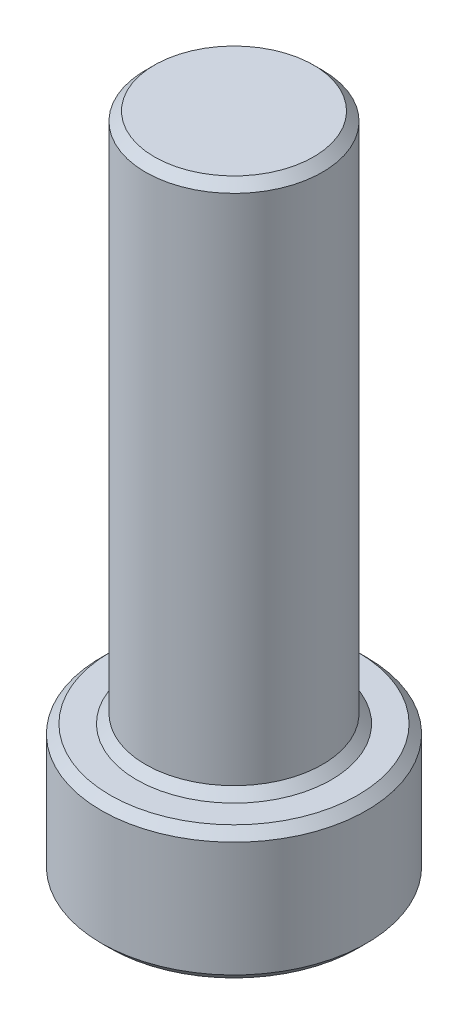
ISO-10303-21;
HEADER;
FILE_DESCRIPTION(('STEP AP214'),'2;1');
FILE_NAME('part.step','',(''),(''),'','','');
FILE_SCHEMA(('AUTOMOTIVE_DESIGN { 1 0 10303 214 1 1 1 1 }'));
ENDSEC;
DATA;
#1=APPLICATION_CONTEXT('core data for automotive mechanical design processes');
#2=APPLICATION_PROTOCOL_DEFINITION('international standard','automotive_design',2000,#1);
#3=PRODUCT_CONTEXT('',#1,'mechanical');
#4=PRODUCT('Part','Part','',(#3));
#5=PRODUCT_RELATED_PRODUCT_CATEGORY('part','',(#4));
#6=PRODUCT_DEFINITION_FORMATION('','',#4);
#7=PRODUCT_DEFINITION_CONTEXT('part definition',#1,'design');
#8=PRODUCT_DEFINITION('design','',#6,#7);
#9=PRODUCT_DEFINITION_SHAPE('','',#8);
#10=(LENGTH_UNIT() NAMED_UNIT(*) SI_UNIT(.MILLI.,.METRE.));
#11=(NAMED_UNIT(*) PLANE_ANGLE_UNIT() SI_UNIT($,.RADIAN.));
#12=(NAMED_UNIT(*) SI_UNIT($,.STERADIAN.) SOLID_ANGLE_UNIT());
#13=UNCERTAINTY_MEASURE_WITH_UNIT(LENGTH_MEASURE(1.E-05),#10,'distance_accuracy_value','');
#14=(GEOMETRIC_REPRESENTATION_CONTEXT(3) GLOBAL_UNCERTAINTY_ASSIGNED_CONTEXT((#13)) GLOBAL_UNIT_ASSIGNED_CONTEXT((#10,
#11,#12)) REPRESENTATION_CONTEXT('',''));
#15=CARTESIAN_POINT('',(0.,0.,0.));
#16=DIRECTION('',(0.,0.,1.));
#17=DIRECTION('',(1.,0.,0.));
#18=AXIS2_PLACEMENT_3D('',#15,#16,#17);
#19=CARTESIAN_POINT('',(0.,3.,0.));
#20=DIRECTION('',(0.,-1.,0.));
#21=DIRECTION('',(0.,0.,-1.));
#22=AXIS2_PLACEMENT_3D('',#19,#20,#21);
#23=CYLINDRICAL_SURFACE('',#22,3.);
#24=CARTESIAN_POINT('',(0.,2.8,0.));
#25=DIRECTION('',(0.,1.,0.));
#26=DIRECTION('',(0.,0.,1.));
#27=AXIS2_PLACEMENT_3D('',#24,#25,#26);
#28=CIRCLE('',#27,3.);
#29=CARTESIAN_POINT('',(0.,2.8,-3.));
#30=VERTEX_POINT('',#29);
#31=EDGE_CURVE('E50',#30,#30,#28,.F.);
#32=ORIENTED_EDGE('',*,*,#31,.T.);
#33=EDGE_LOOP('',(#32));
#34=FACE_BOUND('',#33,.T.);
#35=CARTESIAN_POINT('',(0.,0.200000000000001,0.));
#36=DIRECTION('',(0.,1.,0.));
#37=DIRECTION('',(0.,0.,1.));
#38=AXIS2_PLACEMENT_3D('',#35,#36,#37);
#39=CIRCLE('',#38,3.);
#40=CARTESIAN_POINT('',(0.,0.200000000000001,3.));
#41=VERTEX_POINT('',#40);
#42=EDGE_CURVE('E53',#41,#41,#39,.T.);
#43=ORIENTED_EDGE('',*,*,#42,.T.);
#44=EDGE_LOOP('',(#43));
#45=FACE_BOUND('',#44,.T.);
#46=ADVANCED_FACE('F30',(#34,#45),#23,.T.);
#47=CARTESIAN_POINT('',(0.,3.,0.));
#48=DIRECTION('',(0.,1.,0.));
#49=DIRECTION('',(0.,0.,1.));
#50=AXIS2_PLACEMENT_3D('',#47,#48,#49);
#51=PLANE('',#50);
#52=CARTESIAN_POINT('',(0.,3.,0.));
#53=DIRECTION('',(0.,1.,0.));
#54=DIRECTION('',(0.,0.,1.));
#55=AXIS2_PLACEMENT_3D('',#52,#53,#54);
#56=CIRCLE('',#55,2.2);
#57=CARTESIAN_POINT('',(0.,3.,2.2));
#58=VERTEX_POINT('',#57);
#59=EDGE_CURVE('E56',#58,#58,#56,.F.);
#60=ORIENTED_EDGE('',*,*,#59,.T.);
#61=EDGE_LOOP('',(#60));
#62=FACE_BOUND('',#61,.T.);
#63=CARTESIAN_POINT('',(0.,3.,0.));
#64=DIRECTION('',(0.,1.,0.));
#65=DIRECTION('',(0.,0.,1.));
#66=AXIS2_PLACEMENT_3D('',#63,#64,#65);
#67=CIRCLE('',#66,2.8);
#68=CARTESIAN_POINT('',(0.,3.,-2.8));
#69=VERTEX_POINT('',#68);
#70=EDGE_CURVE('E59',#69,#69,#67,.T.);
#71=ORIENTED_EDGE('',*,*,#70,.T.);
#72=EDGE_LOOP('',(#71));
#73=FACE_BOUND('',#72,.T.);
#74=ADVANCED_FACE('F88',(#62,#73),#51,.T.);
#75=CARTESIAN_POINT('',(0.,0.,0.));
#76=DIRECTION('',(0.,1.,0.));
#77=DIRECTION('',(0.,0.,1.));
#78=AXIS2_PLACEMENT_3D('',#75,#76,#77);
#79=PLANE('',#78);
#80=CARTESIAN_POINT('',(0.,0.,0.));
#81=DIRECTION('',(0.,1.,0.));
#82=DIRECTION('',(0.,0.,1.));
#83=AXIS2_PLACEMENT_3D('',#80,#81,#82);
#84=CIRCLE('',#83,1.85);
#85=CARTESIAN_POINT('',(0.,0.,1.85));
#86=VERTEX_POINT('',#85);
#87=EDGE_CURVE('E37',#86,#86,#84,.T.);
#88=ORIENTED_EDGE('',*,*,#87,.T.);
#89=EDGE_LOOP('',(#88));
#90=FACE_BOUND('',#89,.T.);
#91=CARTESIAN_POINT('',(0.,0.,0.));
#92=DIRECTION('',(0.,1.,0.));
#93=DIRECTION('',(0.,0.,1.));
#94=AXIS2_PLACEMENT_3D('',#91,#92,#93);
#95=CIRCLE('',#94,2.8);
#96=CARTESIAN_POINT('',(0.,0.,2.8));
#97=VERTEX_POINT('',#96);
#98=EDGE_CURVE('E41',#97,#97,#95,.F.);
#99=ORIENTED_EDGE('',*,*,#98,.T.);
#100=EDGE_LOOP('',(#99));
#101=FACE_BOUND('',#100,.T.);
#102=ADVANCED_FACE('F94',(#90,#101),#79,.F.);
#103=CARTESIAN_POINT('',(0.,15.,0.));
#104=DIRECTION('',(0.,-1.,0.));
#105=DIRECTION('',(0.,0.,-1.));
#106=AXIS2_PLACEMENT_3D('',#103,#104,#105);
#107=CYLINDRICAL_SURFACE('',#106,2.);
#108=CARTESIAN_POINT('',(0.,3.20000000000001,0.));
#109=DIRECTION('',(0.,1.,0.));
#110=DIRECTION('',(0.,0.,1.));
#111=AXIS2_PLACEMENT_3D('',#108,#109,#110);
#112=CIRCLE('',#111,2.);
#113=CARTESIAN_POINT('',(0.,3.20000000000001,2.));
#114=VERTEX_POINT('',#113);
#115=EDGE_CURVE('E62',#114,#114,#112,.T.);
#116=ORIENTED_EDGE('',*,*,#115,.T.);
#117=EDGE_LOOP('',(#116));
#118=FACE_BOUND('',#117,.T.);
#119=CARTESIAN_POINT('',(0.,14.8,0.));
#120=DIRECTION('',(0.,1.,0.));
#121=DIRECTION('',(0.,0.,1.));
#122=AXIS2_PLACEMENT_3D('',#119,#120,#121);
#123=CIRCLE('',#122,2.);
#124=CARTESIAN_POINT('',(0.,14.8,2.));
#125=VERTEX_POINT('',#124);
#126=EDGE_CURVE('E65',#125,#125,#123,.F.);
#127=ORIENTED_EDGE('',*,*,#126,.T.);
#128=EDGE_LOOP('',(#127));
#129=FACE_BOUND('',#128,.T.);
#130=ADVANCED_FACE('F85',(#118,#129),#107,.T.);
#131=CARTESIAN_POINT('',(0.,15.,0.));
#132=DIRECTION('',(0.,1.,0.));
#133=DIRECTION('',(0.,0.,1.));
#134=AXIS2_PLACEMENT_3D('',#131,#132,#133);
#135=PLANE('',#134);
#136=CARTESIAN_POINT('',(0.,15.,0.));
#137=DIRECTION('',(0.,1.,0.));
#138=DIRECTION('',(0.,0.,1.));
#139=AXIS2_PLACEMENT_3D('',#136,#137,#138);
#140=CIRCLE('',#139,1.8);
#141=CARTESIAN_POINT('',(0.,15.,1.8));
#142=VERTEX_POINT('',#141);
#143=EDGE_CURVE('E10',#142,#142,#140,.T.);
#144=ORIENTED_EDGE('',*,*,#143,.T.);
#145=EDGE_LOOP('',(#144));
#146=FACE_BOUND('',#145,.T.);
#147=ADVANCED_FACE('F76',(#146),#135,.T.);
#148=CARTESIAN_POINT('',(0.,2.,0.));
#149=DIRECTION('',(0.,-1.,0.));
#150=DIRECTION('',(0.,0.,-1.));
#151=AXIS2_PLACEMENT_3D('',#148,#149,#150);
#152=CYLINDRICAL_SURFACE('',#151,1.65);
#153=CARTESIAN_POINT('',(0.,0.200000000000001,0.));
#154=DIRECTION('',(0.,1.,0.));
#155=DIRECTION('',(0.,0.,1.));
#156=AXIS2_PLACEMENT_3D('',#153,#154,#155);
#157=CIRCLE('',#156,1.65);
#158=CARTESIAN_POINT('',(0.,0.200000000000001,1.65));
#159=VERTEX_POINT('',#158);
#160=EDGE_CURVE('E45',#159,#159,#157,.F.);
#161=ORIENTED_EDGE('',*,*,#160,.T.);
#162=EDGE_LOOP('',(#161));
#163=FACE_BOUND('',#162,.T.);
#164=CARTESIAN_POINT('',(0.,2.,0.));
#165=DIRECTION('',(0.,-1.,0.));
#166=DIRECTION('',(0.,0.,-1.));
#167=AXIS2_PLACEMENT_3D('',#164,#165,#166);
#168=CIRCLE('',#167,1.65);
#169=CARTESIAN_POINT('',(0.,2.,-1.65));
#170=VERTEX_POINT('',#169);
#171=EDGE_CURVE('E68',#170,#170,#168,.T.);
#172=ORIENTED_EDGE('',*,*,#171,.F.);
#173=EDGE_LOOP('',(#172));
#174=FACE_BOUND('',#173,.T.);
#175=ADVANCED_FACE('F74',(#163,#174),#152,.F.);
#176=CARTESIAN_POINT('',(0.,2.,0.));
#177=DIRECTION('',(0.,-1.,0.));
#178=DIRECTION('',(0.,0.,-1.));
#179=AXIS2_PLACEMENT_3D('',#176,#177,#178);
#180=PLANE('',#179);
#181=ORIENTED_EDGE('',*,*,#171,.T.);
#182=EDGE_LOOP('',(#181));
#183=FACE_BOUND('',#182,.T.);
#184=ADVANCED_FACE('F72',(#183),#180,.T.);
#185=CARTESIAN_POINT('',(0.,3.20000000000001,0.));
#186=DIRECTION('',(0.,-1.,0.));
#187=DIRECTION('',(0.,0.,-1.));
#188=AXIS2_PLACEMENT_3D('',#185,#186,#187);
#189=CONICAL_SURFACE('',#188,2.,0.78539816339744);
#190=ORIENTED_EDGE('',*,*,#59,.F.);
#191=EDGE_LOOP('',(#190));
#192=FACE_BOUND('',#191,.T.);
#193=ORIENTED_EDGE('',*,*,#115,.F.);
#194=EDGE_LOOP('',(#193));
#195=FACE_BOUND('',#194,.T.);
#196=ADVANCED_FACE('F83',(#192,#195),#189,.T.);
#197=CARTESIAN_POINT('',(0.,3.,0.));
#198=DIRECTION('',(0.,-1.,0.));
#199=DIRECTION('',(0.,0.,-1.));
#200=AXIS2_PLACEMENT_3D('',#197,#198,#199);
#201=CONICAL_SURFACE('',#200,2.8,0.785398163397447);
#202=CARTESIAN_POINT('',(0.,2.8,-3.));
#203=CARTESIAN_POINT('',(0.,2.80208333333333,-2.99791666666667));
#204=CARTESIAN_POINT('',(0.,2.80416666666667,-2.99583333333333));
#205=CARTESIAN_POINT('',(0.,2.80833333333333,-2.99166666666667));
#206=CARTESIAN_POINT('',(0.,2.81041666666667,-2.98958333333333));
#207=CARTESIAN_POINT('',(0.,2.81458333333333,-2.98541666666667));
#208=CARTESIAN_POINT('',(0.,2.81666666666667,-2.98333333333333));
#209=CARTESIAN_POINT('',(0.,2.82083333333333,-2.97916666666667));
#210=CARTESIAN_POINT('',(0.,2.82291666666667,-2.97708333333333));
#211=CARTESIAN_POINT('',(0.,2.82708333333333,-2.97291666666667));
#212=CARTESIAN_POINT('',(0.,2.82916666666667,-2.97083333333333));
#213=CARTESIAN_POINT('',(0.,2.83333333333333,-2.96666666666667));
#214=CARTESIAN_POINT('',(0.,2.83541666666667,-2.96458333333333));
#215=CARTESIAN_POINT('',(0.,2.83958333333333,-2.96041666666667));
#216=CARTESIAN_POINT('',(0.,2.84166666666667,-2.95833333333333));
#217=CARTESIAN_POINT('',(0.,2.84583333333333,-2.95416666666667));
#218=CARTESIAN_POINT('',(0.,2.84791666666667,-2.95208333333333));
#219=CARTESIAN_POINT('',(0.,2.85208333333333,-2.94791666666667));
#220=CARTESIAN_POINT('',(0.,2.85416666666667,-2.94583333333333));
#221=CARTESIAN_POINT('',(0.,2.85833333333333,-2.94166666666667));
#222=CARTESIAN_POINT('',(0.,2.86041666666667,-2.93958333333333));
#223=CARTESIAN_POINT('',(0.,2.86458333333333,-2.93541666666667));
#224=CARTESIAN_POINT('',(0.,2.86666666666667,-2.93333333333333));
#225=CARTESIAN_POINT('',(0.,2.87083333333333,-2.92916666666667));
#226=CARTESIAN_POINT('',(0.,2.87291666666667,-2.92708333333333));
#227=CARTESIAN_POINT('',(0.,2.87708333333333,-2.92291666666667));
#228=CARTESIAN_POINT('',(0.,2.87916666666667,-2.92083333333333));
#229=CARTESIAN_POINT('',(0.,2.88333333333333,-2.91666666666667));
#230=CARTESIAN_POINT('',(0.,2.88541666666667,-2.91458333333333));
#231=CARTESIAN_POINT('',(0.,2.88958333333333,-2.91041666666667));
#232=CARTESIAN_POINT('',(0.,2.89166666666667,-2.90833333333333));
#233=CARTESIAN_POINT('',(0.,2.89583333333333,-2.90416666666667));
#234=CARTESIAN_POINT('',(0.,2.89791666666667,-2.90208333333333));
#235=CARTESIAN_POINT('',(0.,2.90208333333333,-2.89791666666667));
#236=CARTESIAN_POINT('',(0.,2.90416666666667,-2.89583333333333));
#237=CARTESIAN_POINT('',(0.,2.90833333333333,-2.89166666666667));
#238=CARTESIAN_POINT('',(0.,2.91041666666667,-2.88958333333333));
#239=CARTESIAN_POINT('',(0.,2.91458333333333,-2.88541666666667));
#240=CARTESIAN_POINT('',(0.,2.91666666666667,-2.88333333333333));
#241=CARTESIAN_POINT('',(0.,2.92083333333333,-2.87916666666667));
#242=CARTESIAN_POINT('',(0.,2.92291666666667,-2.87708333333333));
#243=CARTESIAN_POINT('',(0.,2.92708333333333,-2.87291666666667));
#244=CARTESIAN_POINT('',(0.,2.92916666666667,-2.87083333333333));
#245=CARTESIAN_POINT('',(0.,2.93333333333333,-2.86666666666667));
#246=CARTESIAN_POINT('',(0.,2.93541666666667,-2.86458333333333));
#247=CARTESIAN_POINT('',(0.,2.93958333333333,-2.86041666666667));
#248=CARTESIAN_POINT('',(0.,2.94166666666667,-2.85833333333333));
#249=CARTESIAN_POINT('',(0.,2.94583333333333,-2.85416666666667));
#250=CARTESIAN_POINT('',(0.,2.94791666666667,-2.85208333333333));
#251=CARTESIAN_POINT('',(0.,2.95208333333333,-2.84791666666667));
#252=CARTESIAN_POINT('',(0.,2.95416666666667,-2.84583333333333));
#253=CARTESIAN_POINT('',(0.,2.95833333333333,-2.84166666666667));
#254=CARTESIAN_POINT('',(0.,2.96041666666667,-2.83958333333333));
#255=CARTESIAN_POINT('',(0.,2.96458333333333,-2.83541666666667));
#256=CARTESIAN_POINT('',(0.,2.96666666666667,-2.83333333333333));
#257=CARTESIAN_POINT('',(0.,2.97083333333333,-2.82916666666667));
#258=CARTESIAN_POINT('',(0.,2.97291666666667,-2.82708333333333));
#259=CARTESIAN_POINT('',(0.,2.97708333333333,-2.82291666666667));
#260=CARTESIAN_POINT('',(0.,2.97916666666667,-2.82083333333333));
#261=CARTESIAN_POINT('',(0.,2.98333333333333,-2.81666666666667));
#262=CARTESIAN_POINT('',(0.,2.98541666666667,-2.81458333333333));
#263=CARTESIAN_POINT('',(0.,2.98958333333333,-2.81041666666667));
#264=CARTESIAN_POINT('',(0.,2.99166666666667,-2.80833333333333));
#265=CARTESIAN_POINT('',(0.,2.99583333333333,-2.80416666666667));
#266=CARTESIAN_POINT('',(0.,2.99791666666667,-2.80208333333333));
#267=CARTESIAN_POINT('',(0.,3.,-2.8));
#268=B_SPLINE_CURVE_WITH_KNOTS('',3,(#202,#203,#204,#205,#206,#207,#208,#209,#210,#211,#212,
#213,#214,#215,#216,#217,#218,#219,#220,#221,#222,#223,#224,#225,#226,#227,#228,#229,#230,#231,
#232,#233,#234,#235,#236,#237,#238,#239,#240,#241,#242,#243,#244,#245,#246,#247,#248,#249,#250,
#251,#252,#253,#254,#255,#256,#257,#258,#259,#260,#261,#262,#263,#264,#265,#266,#267),
.UNSPECIFIED.,.F.,.F.,(4,2,2,2,2,2,2,2,2,2,2,2,2,2,2,2,2,2,2,2,2,2,2,2,2,2,2,2,2,2,2,2,4),(0.,
0.00883883476483179,0.0176776695296636,0.0265165042944954,0.0353553390593272,0.0441941738241589,
0.0530330085889907,0.0618718433538225,0.0707106781186543,0.0795495128834861,0.0883883476483179,
0.0972271824131497,0.106066017177981,0.114904851942813,0.123743686707645,0.132582521472477,
0.141421356237309,0.150260191002141,0.159099025766972,0.167937860531804,0.176776695296636,
0.185615530061468,0.194454364826299,0.203293199591131,0.212132034355963,0.220970869120795,
0.229809703885627,0.238648538650459,0.24748737341529,0.256326208180122,0.265165042944954,
0.274003877709786,0.282842712474618),.UNSPECIFIED.);
#269=EDGE_CURVE('BSEAM102',#30,#69,#268,.T.);
#270=ORIENTED_EDGE('',*,*,#31,.F.);
#271=ORIENTED_EDGE('',*,*,#70,.F.);
#272=ORIENTED_EDGE('',*,*,#269,.T.);
#273=ORIENTED_EDGE('',*,*,#269,.F.);
#274=EDGE_LOOP('',(#270,#272,#271,#273));
#275=FACE_BOUND('',#274,.T.);
#276=ADVANCED_FACE('F102',(#275),#201,.T.);
#277=CARTESIAN_POINT('',(0.,0.200000000000001,0.));
#278=DIRECTION('',(0.,-1.,0.));
#279=DIRECTION('',(0.,0.,-1.));
#280=AXIS2_PLACEMENT_3D('',#277,#278,#279);
#281=CONICAL_SURFACE('',#280,1.65,0.785398163397452);
#282=ORIENTED_EDGE('',*,*,#87,.F.);
#283=EDGE_LOOP('',(#282));
#284=FACE_BOUND('',#283,.T.);
#285=ORIENTED_EDGE('',*,*,#160,.F.);
#286=EDGE_LOOP('',(#285));
#287=FACE_BOUND('',#286,.T.);
#288=ADVANCED_FACE('F106',(#284,#287),#281,.F.);
#289=CARTESIAN_POINT('',(0.,0.200000000000001,0.));
#290=DIRECTION('',(0.,1.,0.));
#291=DIRECTION('',(0.,0.,1.));
#292=AXIS2_PLACEMENT_3D('',#289,#290,#291);
#293=CONICAL_SURFACE('',#292,3.,0.785398163397453);
#294=ORIENTED_EDGE('',*,*,#98,.F.);
#295=EDGE_LOOP('',(#294));
#296=FACE_BOUND('',#295,.T.);
#297=ORIENTED_EDGE('',*,*,#42,.F.);
#298=EDGE_LOOP('',(#297));
#299=FACE_BOUND('',#298,.T.);
#300=ADVANCED_FACE('F109',(#296,#299),#293,.T.);
#301=CARTESIAN_POINT('',(0.,15.,0.));
#302=DIRECTION('',(0.,-1.,0.));
#303=DIRECTION('',(0.,0.,-1.));
#304=AXIS2_PLACEMENT_3D('',#301,#302,#303);
#305=CONICAL_SURFACE('',#304,1.8,0.785398163397444);
#306=ORIENTED_EDGE('',*,*,#126,.F.);
#307=EDGE_LOOP('',(#306));
#308=FACE_BOUND('',#307,.T.);
#309=ORIENTED_EDGE('',*,*,#143,.F.);
#310=EDGE_LOOP('',(#309));
#311=FACE_BOUND('',#310,.T.);
#312=ADVANCED_FACE('F32',(#308,#311),#305,.T.);
#313=CLOSED_SHELL('',(#46,#74,#102,#130,#147,#175,#184,#196,#276,#288,#300,#312));
#314=MANIFOLD_SOLID_BREP('B2',#313);
#315=ADVANCED_BREP_SHAPE_REPRESENTATION('',(#18,#314),#14);
#316=SHAPE_DEFINITION_REPRESENTATION(#9,#315);
ENDSEC;
END-ISO-10303-21;
